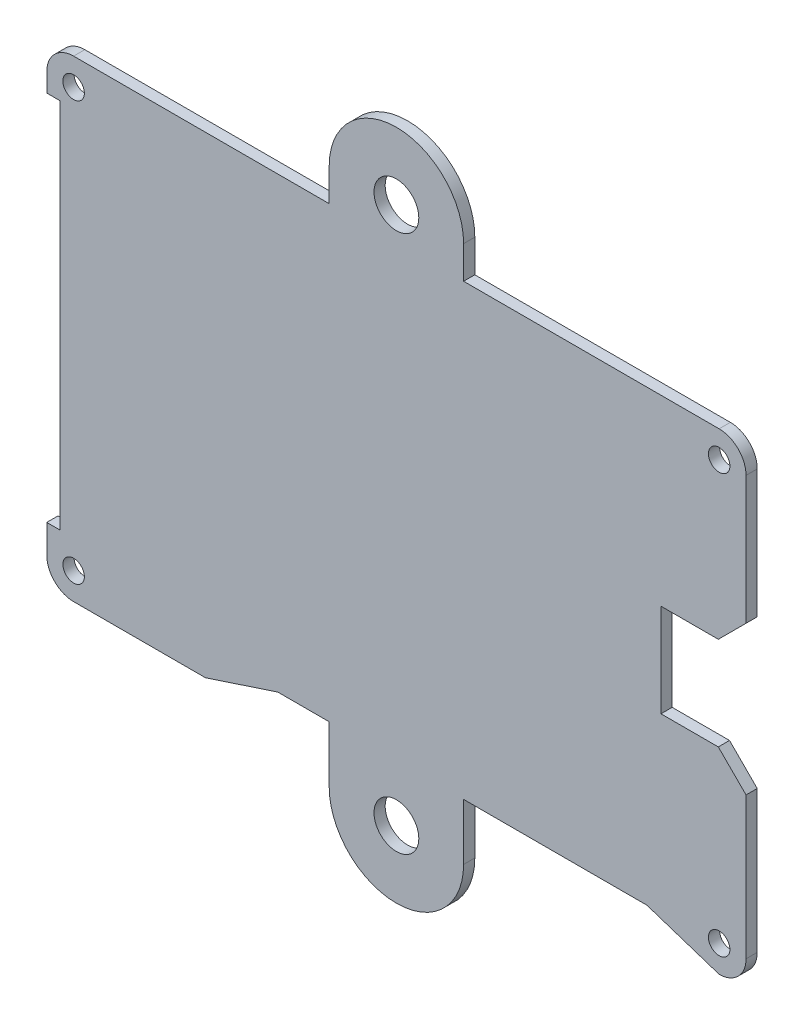
ISO-10303-21;
HEADER;
FILE_DESCRIPTION(('STEP AP214'),'2;1');
FILE_NAME('part.step','',(''),(''),'','','');
FILE_SCHEMA(('AUTOMOTIVE_DESIGN { 1 0 10303 214 1 1 1 1 }'));
ENDSEC;
DATA;
#1=APPLICATION_CONTEXT('core data for automotive mechanical design processes');
#2=APPLICATION_PROTOCOL_DEFINITION('international standard','automotive_design',2000,#1);
#3=PRODUCT_CONTEXT('',#1,'mechanical');
#4=PRODUCT('Part','Part','',(#3));
#5=PRODUCT_RELATED_PRODUCT_CATEGORY('part','',(#4));
#6=PRODUCT_DEFINITION_FORMATION('','',#4);
#7=PRODUCT_DEFINITION_CONTEXT('part definition',#1,'design');
#8=PRODUCT_DEFINITION('design','',#6,#7);
#9=PRODUCT_DEFINITION_SHAPE('','',#8);
#10=(LENGTH_UNIT() NAMED_UNIT(*) SI_UNIT(.MILLI.,.METRE.));
#11=(NAMED_UNIT(*) PLANE_ANGLE_UNIT() SI_UNIT($,.RADIAN.));
#12=(NAMED_UNIT(*) SI_UNIT($,.STERADIAN.) SOLID_ANGLE_UNIT());
#13=UNCERTAINTY_MEASURE_WITH_UNIT(LENGTH_MEASURE(1.E-05),#10,'distance_accuracy_value','');
#14=(GEOMETRIC_REPRESENTATION_CONTEXT(3) GLOBAL_UNCERTAINTY_ASSIGNED_CONTEXT((#13)) GLOBAL_UNIT_ASSIGNED_CONTEXT((#10,
#11,#12)) REPRESENTATION_CONTEXT('',''));
#15=CARTESIAN_POINT('',(0.,0.,0.));
#16=DIRECTION('',(0.,0.,1.));
#17=DIRECTION('',(1.,0.,0.));
#18=AXIS2_PLACEMENT_3D('',#15,#16,#17);
#19=CARTESIAN_POINT('',(-368.3165,91.1883,1.5875));
#20=DIRECTION('',(0.,1.,0.));
#21=DIRECTION('',(-1.,0.,0.));
#22=AXIS2_PLACEMENT_3D('',#19,#20,#21);
#23=PLANE('',#22);
#24=DIRECTION('',(0.,0.,1.));
#25=VECTOR('',#24,1.);
#26=CARTESIAN_POINT('',(-361.0272,91.1883,0.));
#27=LINE('',#26,#25);
#28=CARTESIAN_POINT('',(-361.0272,91.1883,0.));
#29=VERTEX_POINT('',#28);
#30=CARTESIAN_POINT('',(-361.0272,91.1883,1.5875));
#31=VERTEX_POINT('',#30);
#32=EDGE_CURVE('E423',#29,#31,#27,.T.);
#33=ORIENTED_EDGE('',*,*,#32,.T.);
#34=DIRECTION('',(1.,0.,0.));
#35=VECTOR('',#34,1.);
#36=CARTESIAN_POINT('',(-368.3165,91.1883,1.5875));
#37=LINE('',#36,#35);
#38=CARTESIAN_POINT('',(-368.3165,91.1883,1.5875));
#39=VERTEX_POINT('',#38);
#40=EDGE_CURVE('E368',#39,#31,#37,.T.);
#41=ORIENTED_EDGE('',*,*,#40,.F.);
#42=DIRECTION('',(0.,0.,-1.));
#43=VECTOR('',#42,1.);
#44=CARTESIAN_POINT('',(-368.3165,91.1883,1.5875));
#45=LINE('',#44,#43);
#46=CARTESIAN_POINT('',(-368.3165,91.1883,0.));
#47=VERTEX_POINT('',#46);
#48=EDGE_CURVE('E301',#39,#47,#45,.T.);
#49=ORIENTED_EDGE('',*,*,#48,.T.);
#50=DIRECTION('',(1.,0.,0.));
#51=VECTOR('',#50,1.);
#52=CARTESIAN_POINT('',(-368.3165,91.1883,0.));
#53=LINE('',#52,#51);
#54=EDGE_CURVE('E283',#47,#29,#53,.T.);
#55=ORIENTED_EDGE('',*,*,#54,.T.);
#56=EDGE_LOOP('',(#33,#41,#49,#55));
#57=FACE_BOUND('',#56,.T.);
#58=ADVANCED_FACE('F35',(#57),#23,.F.);
#59=CARTESIAN_POINT('',(-305.7573,154.7804,1.5875));
#60=DIRECTION('',(0.,-1.,0.));
#61=DIRECTION('',(1.,0.,0.));
#62=AXIS2_PLACEMENT_3D('',#59,#60,#61);
#63=PLANE('',#62);
#64=DIRECTION('',(0.,0.,1.));
#65=VECTOR('',#64,1.);
#66=CARTESIAN_POINT('',(-361.0272,154.7804,0.));
#67=LINE('',#66,#65);
#68=CARTESIAN_POINT('',(-361.0272,154.7804,0.));
#69=VERTEX_POINT('',#68);
#70=CARTESIAN_POINT('',(-361.0272,154.7804,1.5875));
#71=VERTEX_POINT('',#70);
#72=EDGE_CURVE('E362',#69,#71,#67,.T.);
#73=ORIENTED_EDGE('',*,*,#72,.F.);
#74=DIRECTION('',(-1.,0.,0.));
#75=VECTOR('',#74,1.);
#76=CARTESIAN_POINT('',(-305.7573,154.7804,0.));
#77=LINE('',#76,#75);
#78=CARTESIAN_POINT('',(-397.247125,154.7804,0.));
#79=VERTEX_POINT('',#78);
#80=EDGE_CURVE('E260',#69,#79,#77,.T.);
#81=ORIENTED_EDGE('',*,*,#80,.T.);
#82=DIRECTION('',(0.,0.,-1.));
#83=VECTOR('',#82,1.);
#84=CARTESIAN_POINT('',(-397.247125,154.7804,1.5875));
#85=LINE('',#84,#83);
#86=CARTESIAN_POINT('',(-397.247125,154.7804,1.5875));
#87=VERTEX_POINT('',#86);
#88=EDGE_CURVE('E328',#87,#79,#85,.T.);
#89=ORIENTED_EDGE('',*,*,#88,.F.);
#90=DIRECTION('',(-1.,0.,0.));
#91=VECTOR('',#90,1.);
#92=CARTESIAN_POINT('',(-305.7573,154.7804,1.5875));
#93=LINE('',#92,#91);
#94=EDGE_CURVE('E393',#71,#87,#93,.T.);
#95=ORIENTED_EDGE('',*,*,#94,.F.);
#96=EDGE_LOOP('',(#73,#81,#89,#95));
#97=FACE_BOUND('',#96,.T.);
#98=ADVANCED_FACE('F565',(#97),#63,.F.);
#99=CARTESIAN_POINT('',(-305.7573,150.9704,1.5875));
#100=DIRECTION('',(0.,0.,1.));
#101=DIRECTION('',(1.,0.,0.));
#102=AXIS2_PLACEMENT_3D('',#99,#100,#101);
#103=PLANE('',#102);
#104=DIRECTION('',(-1.,0.,0.));
#105=VECTOR('',#104,1.);
#106=CARTESIAN_POINT('',(-305.87795,115.6771,1.5875));
#107=LINE('',#106,#105);
#108=CARTESIAN_POINT('',(-305.87795,115.6771,1.5875));
#109=VERTEX_POINT('',#108);
#110=CARTESIAN_POINT('',(-314.004803439884,115.6771,1.5875));
#111=VERTEX_POINT('',#110);
#112=EDGE_CURVE('E346',#109,#111,#107,.T.);
#113=ORIENTED_EDGE('',*,*,#112,.T.);
#114=DIRECTION('',(0.,1.,0.));
#115=VECTOR('',#114,1.);
#116=CARTESIAN_POINT('',(-314.004803439884,128.8851,1.5875));
#117=LINE('',#116,#115);
#118=CARTESIAN_POINT('',(-314.004803439884,128.8851,1.5875));
#119=VERTEX_POINT('',#118);
#120=EDGE_CURVE('E50',#111,#119,#117,.T.);
#121=ORIENTED_EDGE('',*,*,#120,.T.);
#122=DIRECTION('',(1.,0.,0.));
#123=VECTOR('',#122,1.);
#124=CARTESIAN_POINT('',(-316.1078,128.8851,1.5875));
#125=LINE('',#124,#123);
#126=CARTESIAN_POINT('',(-305.87795,128.8851,1.5875));
#127=VERTEX_POINT('',#126);
#128=EDGE_CURVE('E242',#119,#127,#125,.T.);
#129=ORIENTED_EDGE('',*,*,#128,.T.);
#130=DIRECTION('',(0.70710678118655,0.707106781186545,0.));
#131=VECTOR('',#130,1.);
#132=CARTESIAN_POINT('',(-305.87795,128.8851,1.5875));
#133=LINE('',#132,#131);
#134=CARTESIAN_POINT('',(-301.9473,132.81575,1.5875));
#135=VERTEX_POINT('',#134);
#136=EDGE_CURVE('E398',#127,#135,#133,.T.);
#137=ORIENTED_EDGE('',*,*,#136,.T.);
#138=DIRECTION('',(0.,1.,0.));
#139=VECTOR('',#138,1.);
#140=CARTESIAN_POINT('',(-301.9473,132.81575,1.5875));
#141=LINE('',#140,#139);
#142=CARTESIAN_POINT('',(-301.9473,150.9704,1.5875));
#143=VERTEX_POINT('',#142);
#144=EDGE_CURVE('E396',#135,#143,#141,.T.);
#145=ORIENTED_EDGE('',*,*,#144,.T.);
#146=CARTESIAN_POINT('',(-305.7573,150.9704,1.5875));
#147=DIRECTION('',(0.,0.,1.));
#148=DIRECTION('',(1.,0.,0.));
#149=AXIS2_PLACEMENT_3D('',#146,#147,#148);
#150=CIRCLE('',#149,3.80999999999994);
#151=CARTESIAN_POINT('',(-305.7573,154.7804,1.5875));
#152=VERTEX_POINT('',#151);
#153=EDGE_CURVE('E394',#143,#152,#150,.T.);
#154=ORIENTED_EDGE('',*,*,#153,.T.);
#155=CARTESIAN_POINT('',(-341.9772,154.7804,1.5875));
#156=VERTEX_POINT('',#155);
#157=EDGE_CURVE('E390',#152,#156,#93,.T.);
#158=ORIENTED_EDGE('',*,*,#157,.T.);
#159=DIRECTION('',(0.,1.,0.));
#160=VECTOR('',#159,1.);
#161=CARTESIAN_POINT('',(-341.9772,0.,1.5875));
#162=LINE('',#161,#160);
#163=CARTESIAN_POINT('',(-341.9772,159.40105,1.5875));
#164=VERTEX_POINT('',#163);
#165=EDGE_CURVE('E417',#156,#164,#162,.T.);
#166=ORIENTED_EDGE('',*,*,#165,.T.);
#167=CARTESIAN_POINT('',(-351.5022,159.40105,1.5875));
#168=DIRECTION('',(0.,0.,1.));
#169=DIRECTION('',(1.,0.,0.));
#170=AXIS2_PLACEMENT_3D('',#167,#168,#169);
#171=CIRCLE('',#170,9.52500000000001);
#172=CARTESIAN_POINT('',(-361.0272,159.40105,1.5875));
#173=VERTEX_POINT('',#172);
#174=EDGE_CURVE('E414',#164,#173,#171,.T.);
#175=ORIENTED_EDGE('',*,*,#174,.T.);
#176=DIRECTION('',(0.,1.,0.));
#177=VECTOR('',#176,1.);
#178=CARTESIAN_POINT('',(-361.0272,0.,1.5875));
#179=LINE('',#178,#177);
#180=EDGE_CURVE('E410',#71,#173,#179,.T.);
#181=ORIENTED_EDGE('',*,*,#180,.F.);
#182=ORIENTED_EDGE('',*,*,#94,.T.);
#183=CARTESIAN_POINT('',(-397.247125,150.9704,1.5875));
#184=DIRECTION('',(0.,0.,1.));
#185=DIRECTION('',(1.,0.,0.));
#186=AXIS2_PLACEMENT_3D('',#183,#184,#185);
#187=CIRCLE('',#186,3.81000000000001);
#188=CARTESIAN_POINT('',(-401.0571,150.956597848903,1.5875));
#189=VERTEX_POINT('',#188);
#190=EDGE_CURVE('E388',#87,#189,#187,.T.);
#191=ORIENTED_EDGE('',*,*,#190,.T.);
#192=DIRECTION('',(0.,-1.,0.));
#193=VECTOR('',#192,1.);
#194=CARTESIAN_POINT('',(-401.0571,150.956597848903,1.5875));
#195=LINE('',#194,#193);
#196=CARTESIAN_POINT('',(-401.0571,148.341,1.5875));
#197=VERTEX_POINT('',#196);
#198=EDGE_CURVE('E386',#189,#197,#195,.T.);
#199=ORIENTED_EDGE('',*,*,#198,.T.);
#200=DIRECTION('',(1.,0.,0.));
#201=VECTOR('',#200,1.);
#202=CARTESIAN_POINT('',(-401.0571,148.341,1.5875));
#203=LINE('',#202,#201);
#204=CARTESIAN_POINT('',(-399.1521,148.341,1.5875));
#205=VERTEX_POINT('',#204);
#206=EDGE_CURVE('E384',#197,#205,#203,.T.);
#207=ORIENTED_EDGE('',*,*,#206,.T.);
#208=DIRECTION('',(0.,-1.,0.));
#209=VECTOR('',#208,1.);
#210=CARTESIAN_POINT('',(-399.1521,148.341,1.5875));
#211=LINE('',#210,#209);
#212=CARTESIAN_POINT('',(-399.1521,95.6449,1.5875));
#213=VERTEX_POINT('',#212);
#214=EDGE_CURVE('E382',#205,#213,#211,.T.);
#215=ORIENTED_EDGE('',*,*,#214,.T.);
#216=DIRECTION('',(-1.,0.,0.));
#217=VECTOR('',#216,1.);
#218=CARTESIAN_POINT('',(-399.1521,95.6449,1.5875));
#219=LINE('',#218,#217);
#220=CARTESIAN_POINT('',(-401.0571,95.6449,1.5875));
#221=VERTEX_POINT('',#220);
#222=EDGE_CURVE('E380',#213,#221,#219,.T.);
#223=ORIENTED_EDGE('',*,*,#222,.T.);
#224=DIRECTION('',(0.,-1.,0.));
#225=VECTOR('',#224,1.);
#226=CARTESIAN_POINT('',(-401.0571,95.6449,1.5875));
#227=LINE('',#226,#225);
#228=CARTESIAN_POINT('',(-401.0571,91.6593041663556,1.5875));
#229=VERTEX_POINT('',#228);
#230=EDGE_CURVE('E378',#221,#229,#227,.T.);
#231=ORIENTED_EDGE('',*,*,#230,.T.);
#232=CARTESIAN_POINT('',(-397.2472,91.6317,1.5875));
#233=DIRECTION('',(0.,0.,1.));
#234=DIRECTION('',(1.,0.,0.));
#235=AXIS2_PLACEMENT_3D('',#232,#233,#234);
#236=CIRCLE('',#235,3.81);
#237=CARTESIAN_POINT('',(-397.2472,87.8217,1.5875));
#238=VERTEX_POINT('',#237);
#239=EDGE_CURVE('E376',#229,#238,#236,.T.);
#240=ORIENTED_EDGE('',*,*,#239,.T.);
#241=DIRECTION('',(1.,0.,0.));
#242=VECTOR('',#241,1.);
#243=CARTESIAN_POINT('',(-397.2472,87.8217,1.5875));
#244=LINE('',#243,#242);
#245=CARTESIAN_POINT('',(-378.5565,87.8217,1.5875));
#246=VERTEX_POINT('',#245);
#247=EDGE_CURVE('E374',#238,#246,#244,.T.);
#248=ORIENTED_EDGE('',*,*,#247,.T.);
#249=DIRECTION('',(0.949975924247208,0.312323139313538,0.));
#250=VECTOR('',#249,1.);
#251=CARTESIAN_POINT('',(-378.5565,87.8217,1.5875));
#252=LINE('',#251,#250);
#253=EDGE_CURVE('E372',#246,#39,#252,.T.);
#254=ORIENTED_EDGE('',*,*,#253,.T.);
#255=ORIENTED_EDGE('',*,*,#40,.T.);
#256=DIRECTION('',(0.,1.,0.));
#257=VECTOR('',#256,1.);
#258=CARTESIAN_POINT('',(-361.0272,0.,1.5875));
#259=LINE('',#258,#257);
#260=CARTESIAN_POINT('',(-361.0272,83.20105,1.5875));
#261=VERTEX_POINT('',#260);
#262=EDGE_CURVE('E446',#261,#31,#259,.T.);
#263=ORIENTED_EDGE('',*,*,#262,.F.);
#264=CARTESIAN_POINT('',(-351.5022,83.20105,1.5875));
#265=DIRECTION('',(0.,0.,1.));
#266=DIRECTION('',(1.,0.,0.));
#267=AXIS2_PLACEMENT_3D('',#264,#265,#266);
#268=CIRCLE('',#267,9.52500000000001);
#269=CARTESIAN_POINT('',(-341.9772,83.20105,1.5875));
#270=VERTEX_POINT('',#269);
#271=EDGE_CURVE('E444',#261,#270,#268,.T.);
#272=ORIENTED_EDGE('',*,*,#271,.T.);
#273=DIRECTION('',(0.,1.,0.));
#274=VECTOR('',#273,1.);
#275=CARTESIAN_POINT('',(-341.9772,0.,1.5875));
#276=LINE('',#275,#274);
#277=CARTESIAN_POINT('',(-341.9772,91.1883,1.5875));
#278=VERTEX_POINT('',#277);
#279=EDGE_CURVE('E57',#270,#278,#276,.T.);
#280=ORIENTED_EDGE('',*,*,#279,.T.);
#281=CARTESIAN_POINT('',(-315.9973,91.1883,1.5875));
#282=VERTEX_POINT('',#281);
#283=EDGE_CURVE('E371',#278,#282,#37,.T.);
#284=ORIENTED_EDGE('',*,*,#283,.T.);
#285=DIRECTION('',(0.949975924247207,-0.312323139313541,0.));
#286=VECTOR('',#285,1.);
#287=CARTESIAN_POINT('',(-315.9973,91.1883,1.5875));
#288=LINE('',#287,#286);
#289=CARTESIAN_POINT('',(-305.7573,87.8217,1.5875));
#290=VERTEX_POINT('',#289);
#291=EDGE_CURVE('E366',#282,#290,#288,.T.);
#292=ORIENTED_EDGE('',*,*,#291,.T.);
#293=CARTESIAN_POINT('',(-305.7573,91.6317,1.5875));
#294=DIRECTION('',(0.,0.,1.));
#295=DIRECTION('',(1.,0.,0.));
#296=AXIS2_PLACEMENT_3D('',#293,#294,#295);
#297=CIRCLE('',#296,3.81);
#298=CARTESIAN_POINT('',(-301.9473,91.6317,1.5875));
#299=VERTEX_POINT('',#298);
#300=EDGE_CURVE('E295',#290,#299,#297,.T.);
#301=ORIENTED_EDGE('',*,*,#300,.T.);
#302=DIRECTION('',(0.,1.,0.));
#303=VECTOR('',#302,1.);
#304=CARTESIAN_POINT('',(-301.9473,91.6317,1.5875));
#305=LINE('',#304,#303);
#306=CARTESIAN_POINT('',(-301.9473,111.74645,1.5875));
#307=VERTEX_POINT('',#306);
#308=EDGE_CURVE('E290',#299,#307,#305,.T.);
#309=ORIENTED_EDGE('',*,*,#308,.T.);
#310=DIRECTION('',(-0.70710678118655,0.707106781186545,0.));
#311=VECTOR('',#310,1.);
#312=CARTESIAN_POINT('',(-301.9473,111.74645,1.5875));
#313=LINE('',#312,#311);
#314=EDGE_CURVE('E354',#307,#109,#313,.T.);
#315=ORIENTED_EDGE('',*,*,#314,.T.);
#316=EDGE_LOOP('',(#113,#121,#129,#137,#145,#154,#158,#166,#175,#181,#182,#191,#199,#207,#215,
#223,#231,#240,#248,#254,#255,#263,#272,#280,#284,#292,#301,#309,#315));
#317=FACE_BOUND('',#316,.T.);
#318=CARTESIAN_POINT('',(-397.2472,91.6317,1.5875));
#319=DIRECTION('',(0.,0.,1.));
#320=DIRECTION('',(1.,0.,0.));
#321=AXIS2_PLACEMENT_3D('',#318,#319,#320);
#322=CIRCLE('',#321,1.52400000000001);
#323=CARTESIAN_POINT('',(-395.7232,91.6317,1.5875));
#324=VERTEX_POINT('',#323);
#325=EDGE_CURVE('E478',#324,#324,#322,.T.);
#326=ORIENTED_EDGE('',*,*,#325,.F.);
#327=EDGE_LOOP('',(#326));
#328=FACE_BOUND('',#327,.T.);
#329=CARTESIAN_POINT('',(-305.7573,91.6317,1.5875));
#330=DIRECTION('',(0.,0.,1.));
#331=DIRECTION('',(1.,0.,0.));
#332=AXIS2_PLACEMENT_3D('',#329,#330,#331);
#333=CIRCLE('',#332,1.52400000000001);
#334=CARTESIAN_POINT('',(-304.2333,91.6317,1.5875));
#335=VERTEX_POINT('',#334);
#336=EDGE_CURVE('E472',#335,#335,#333,.T.);
#337=ORIENTED_EDGE('',*,*,#336,.F.);
#338=EDGE_LOOP('',(#337));
#339=FACE_BOUND('',#338,.T.);
#340=CARTESIAN_POINT('',(-305.7573,150.9704,1.5875));
#341=DIRECTION('',(0.,0.,1.));
#342=DIRECTION('',(1.,0.,0.));
#343=AXIS2_PLACEMENT_3D('',#340,#341,#342);
#344=CIRCLE('',#343,1.52400000000001);
#345=CARTESIAN_POINT('',(-304.2333,150.9704,1.5875));
#346=VERTEX_POINT('',#345);
#347=EDGE_CURVE('E466',#346,#346,#344,.T.);
#348=ORIENTED_EDGE('',*,*,#347,.F.);
#349=EDGE_LOOP('',(#348));
#350=FACE_BOUND('',#349,.T.);
#351=CARTESIAN_POINT('',(-397.247125,150.9704,1.5875));
#352=DIRECTION('',(0.,0.,1.));
#353=DIRECTION('',(1.,0.,0.));
#354=AXIS2_PLACEMENT_3D('',#351,#352,#353);
#355=CIRCLE('',#354,1.52400000000001);
#356=CARTESIAN_POINT('',(-395.723125,150.9704,1.5875));
#357=VERTEX_POINT('',#356);
#358=EDGE_CURVE('E460',#357,#357,#355,.T.);
#359=ORIENTED_EDGE('',*,*,#358,.F.);
#360=EDGE_LOOP('',(#359));
#361=FACE_BOUND('',#360,.T.);
#362=CARTESIAN_POINT('',(-351.5022,159.40105,1.5875));
#363=DIRECTION('',(0.,0.,1.));
#364=DIRECTION('',(1.,0.,0.));
#365=AXIS2_PLACEMENT_3D('',#362,#363,#364);
#366=CIRCLE('',#365,3.17499999999997);
#367=CARTESIAN_POINT('',(-348.3272,159.40105,1.5875));
#368=VERTEX_POINT('',#367);
#369=EDGE_CURVE('E420',#368,#368,#366,.T.);
#370=ORIENTED_EDGE('',*,*,#369,.F.);
#371=EDGE_LOOP('',(#370));
#372=FACE_BOUND('',#371,.T.);
#373=CARTESIAN_POINT('',(-351.5022,83.20105,1.5875));
#374=DIRECTION('',(0.,0.,1.));
#375=DIRECTION('',(1.,0.,0.));
#376=AXIS2_PLACEMENT_3D('',#373,#374,#375);
#377=CIRCLE('',#376,3.17499999999997);
#378=CARTESIAN_POINT('',(-348.3272,83.20105,1.5875));
#379=VERTEX_POINT('',#378);
#380=EDGE_CURVE('E448',#379,#379,#377,.T.);
#381=ORIENTED_EDGE('',*,*,#380,.F.);
#382=EDGE_LOOP('',(#381));
#383=FACE_BOUND('',#382,.T.);
#384=ADVANCED_FACE('F484',(#317,#328,#339,#350,#361,#372,#383),#103,.T.);
#385=CARTESIAN_POINT('',(-305.7573,150.9704,0.));
#386=DIRECTION('',(0.,0.,1.));
#387=DIRECTION('',(1.,0.,0.));
#388=AXIS2_PLACEMENT_3D('',#385,#386,#387);
#389=PLANE('',#388);
#390=DIRECTION('',(0.,1.,0.));
#391=VECTOR('',#390,1.);
#392=CARTESIAN_POINT('',(-314.004803439884,128.8851,0.));
#393=LINE('',#392,#391);
#394=CARTESIAN_POINT('',(-314.004803439884,115.6771,0.));
#395=VERTEX_POINT('',#394);
#396=CARTESIAN_POINT('',(-314.004803439884,128.8851,0.));
#397=VERTEX_POINT('',#396);
#398=EDGE_CURVE('E225',#395,#397,#393,.T.);
#399=ORIENTED_EDGE('',*,*,#398,.F.);
#400=DIRECTION('',(-1.,0.,0.));
#401=VECTOR('',#400,1.);
#402=CARTESIAN_POINT('',(-305.87795,115.6771,0.));
#403=LINE('',#402,#401);
#404=CARTESIAN_POINT('',(-305.87795,115.6771,0.));
#405=VERTEX_POINT('',#404);
#406=EDGE_CURVE('E249',#405,#395,#403,.T.);
#407=ORIENTED_EDGE('',*,*,#406,.F.);
#408=DIRECTION('',(-0.70710678118655,0.707106781186545,0.));
#409=VECTOR('',#408,1.);
#410=CARTESIAN_POINT('',(-301.9473,111.74645,0.));
#411=LINE('',#410,#409);
#412=CARTESIAN_POINT('',(-301.9473,111.74645,0.));
#413=VERTEX_POINT('',#412);
#414=EDGE_CURVE('E253',#413,#405,#411,.T.);
#415=ORIENTED_EDGE('',*,*,#414,.F.);
#416=DIRECTION('',(0.,1.,0.));
#417=VECTOR('',#416,1.);
#418=CARTESIAN_POINT('',(-301.9473,91.6317,0.));
#419=LINE('',#418,#417);
#420=CARTESIAN_POINT('',(-301.9473,91.6317,0.));
#421=VERTEX_POINT('',#420);
#422=EDGE_CURVE('E351',#421,#413,#419,.T.);
#423=ORIENTED_EDGE('',*,*,#422,.F.);
#424=CARTESIAN_POINT('',(-305.7573,91.6317,0.));
#425=DIRECTION('',(0.,0.,1.));
#426=DIRECTION('',(1.,0.,0.));
#427=AXIS2_PLACEMENT_3D('',#424,#425,#426);
#428=CIRCLE('',#427,3.81);
#429=CARTESIAN_POINT('',(-305.7573,87.8217,0.));
#430=VERTEX_POINT('',#429);
#431=EDGE_CURVE('E288',#430,#421,#428,.T.);
#432=ORIENTED_EDGE('',*,*,#431,.F.);
#433=DIRECTION('',(0.949975924247207,-0.312323139313541,0.));
#434=VECTOR('',#433,1.);
#435=CARTESIAN_POINT('',(-315.9973,91.1883,0.));
#436=LINE('',#435,#434);
#437=CARTESIAN_POINT('',(-315.9973,91.1883,0.));
#438=VERTEX_POINT('',#437);
#439=EDGE_CURVE('E286',#438,#430,#436,.T.);
#440=ORIENTED_EDGE('',*,*,#439,.F.);
#441=CARTESIAN_POINT('',(-341.9772,91.1883,0.));
#442=VERTEX_POINT('',#441);
#443=EDGE_CURVE('E282',#442,#438,#53,.T.);
#444=ORIENTED_EDGE('',*,*,#443,.F.);
#445=DIRECTION('',(0.,1.,0.));
#446=VECTOR('',#445,1.);
#447=CARTESIAN_POINT('',(-341.9772,0.,0.));
#448=LINE('',#447,#446);
#449=CARTESIAN_POINT('',(-341.9772,83.20105,0.));
#450=VERTEX_POINT('',#449);
#451=EDGE_CURVE('E436',#450,#442,#448,.T.);
#452=ORIENTED_EDGE('',*,*,#451,.F.);
#453=CARTESIAN_POINT('',(-351.5022,83.20105,0.));
#454=DIRECTION('',(0.,0.,1.));
#455=DIRECTION('',(1.,0.,0.));
#456=AXIS2_PLACEMENT_3D('',#453,#454,#455);
#457=CIRCLE('',#456,9.52500000000001);
#458=CARTESIAN_POINT('',(-361.0272,83.20105,0.));
#459=VERTEX_POINT('',#458);
#460=EDGE_CURVE('E453',#459,#450,#457,.T.);
#461=ORIENTED_EDGE('',*,*,#460,.F.);
#462=DIRECTION('',(0.,1.,0.));
#463=VECTOR('',#462,1.);
#464=CARTESIAN_POINT('',(-361.0272,0.,0.));
#465=LINE('',#464,#463);
#466=EDGE_CURVE('E456',#459,#29,#465,.T.);
#467=ORIENTED_EDGE('',*,*,#466,.T.);
#468=ORIENTED_EDGE('',*,*,#54,.F.);
#469=DIRECTION('',(0.949975924247208,0.312323139313538,0.));
#470=VECTOR('',#469,1.);
#471=CARTESIAN_POINT('',(-378.5565,87.8217,0.));
#472=LINE('',#471,#470);
#473=CARTESIAN_POINT('',(-378.5565,87.8217,0.));
#474=VERTEX_POINT('',#473);
#475=EDGE_CURVE('E280',#474,#47,#472,.T.);
#476=ORIENTED_EDGE('',*,*,#475,.F.);
#477=DIRECTION('',(1.,0.,0.));
#478=VECTOR('',#477,1.);
#479=CARTESIAN_POINT('',(-397.2472,87.8217,0.));
#480=LINE('',#479,#478);
#481=CARTESIAN_POINT('',(-397.2472,87.8217,0.));
#482=VERTEX_POINT('',#481);
#483=EDGE_CURVE('E278',#482,#474,#480,.T.);
#484=ORIENTED_EDGE('',*,*,#483,.F.);
#485=CARTESIAN_POINT('',(-397.2472,91.6317,0.));
#486=DIRECTION('',(0.,0.,1.));
#487=DIRECTION('',(1.,0.,0.));
#488=AXIS2_PLACEMENT_3D('',#485,#486,#487);
#489=CIRCLE('',#488,3.81);
#490=CARTESIAN_POINT('',(-401.0571,91.6593041663556,0.));
#491=VERTEX_POINT('',#490);
#492=EDGE_CURVE('E276',#491,#482,#489,.T.);
#493=ORIENTED_EDGE('',*,*,#492,.F.);
#494=DIRECTION('',(0.,-1.,0.));
#495=VECTOR('',#494,1.);
#496=CARTESIAN_POINT('',(-401.0571,95.6449,0.));
#497=LINE('',#496,#495);
#498=CARTESIAN_POINT('',(-401.0571,95.6449,0.));
#499=VERTEX_POINT('',#498);
#500=EDGE_CURVE('E274',#499,#491,#497,.T.);
#501=ORIENTED_EDGE('',*,*,#500,.F.);
#502=DIRECTION('',(-1.,0.,0.));
#503=VECTOR('',#502,1.);
#504=CARTESIAN_POINT('',(-399.1521,95.6449,0.));
#505=LINE('',#504,#503);
#506=CARTESIAN_POINT('',(-399.1521,95.6449,0.));
#507=VERTEX_POINT('',#506);
#508=EDGE_CURVE('E272',#507,#499,#505,.T.);
#509=ORIENTED_EDGE('',*,*,#508,.F.);
#510=DIRECTION('',(0.,-1.,0.));
#511=VECTOR('',#510,1.);
#512=CARTESIAN_POINT('',(-399.1521,148.341,0.));
#513=LINE('',#512,#511);
#514=CARTESIAN_POINT('',(-399.1521,148.341,0.));
#515=VERTEX_POINT('',#514);
#516=EDGE_CURVE('E270',#515,#507,#513,.T.);
#517=ORIENTED_EDGE('',*,*,#516,.F.);
#518=DIRECTION('',(1.,0.,0.));
#519=VECTOR('',#518,1.);
#520=CARTESIAN_POINT('',(-401.0571,148.341,0.));
#521=LINE('',#520,#519);
#522=CARTESIAN_POINT('',(-401.0571,148.341,0.));
#523=VERTEX_POINT('',#522);
#524=EDGE_CURVE('E268',#523,#515,#521,.T.);
#525=ORIENTED_EDGE('',*,*,#524,.F.);
#526=DIRECTION('',(0.,-1.,0.));
#527=VECTOR('',#526,1.);
#528=CARTESIAN_POINT('',(-401.0571,150.956597848903,0.));
#529=LINE('',#528,#527);
#530=CARTESIAN_POINT('',(-401.0571,150.956597848903,0.));
#531=VERTEX_POINT('',#530);
#532=EDGE_CURVE('E266',#531,#523,#529,.T.);
#533=ORIENTED_EDGE('',*,*,#532,.F.);
#534=CARTESIAN_POINT('',(-397.247125,150.9704,0.));
#535=DIRECTION('',(0.,0.,1.));
#536=DIRECTION('',(1.,0.,0.));
#537=AXIS2_PLACEMENT_3D('',#534,#535,#536);
#538=CIRCLE('',#537,3.81000000000001);
#539=EDGE_CURVE('E264',#79,#531,#538,.T.);
#540=ORIENTED_EDGE('',*,*,#539,.F.);
#541=ORIENTED_EDGE('',*,*,#80,.F.);
#542=DIRECTION('',(0.,1.,0.));
#543=VECTOR('',#542,1.);
#544=CARTESIAN_POINT('',(-361.0272,0.,0.));
#545=LINE('',#544,#543);
#546=CARTESIAN_POINT('',(-361.0272,159.40105,0.));
#547=VERTEX_POINT('',#546);
#548=EDGE_CURVE('E407',#69,#547,#545,.T.);
#549=ORIENTED_EDGE('',*,*,#548,.T.);
#550=CARTESIAN_POINT('',(-351.5022,159.40105,0.));
#551=DIRECTION('',(0.,0.,1.));
#552=DIRECTION('',(1.,0.,0.));
#553=AXIS2_PLACEMENT_3D('',#550,#551,#552);
#554=CIRCLE('',#553,9.52500000000001);
#555=CARTESIAN_POINT('',(-341.9772,159.40105,0.));
#556=VERTEX_POINT('',#555);
#557=EDGE_CURVE('E425',#556,#547,#554,.T.);
#558=ORIENTED_EDGE('',*,*,#557,.F.);
#559=DIRECTION('',(0.,1.,0.));
#560=VECTOR('',#559,1.);
#561=CARTESIAN_POINT('',(-341.9772,0.,0.));
#562=LINE('',#561,#560);
#563=CARTESIAN_POINT('',(-341.9772,154.7804,0.));
#564=VERTEX_POINT('',#563);
#565=EDGE_CURVE('E428',#564,#556,#562,.T.);
#566=ORIENTED_EDGE('',*,*,#565,.F.);
#567=CARTESIAN_POINT('',(-305.7573,154.7804,0.));
#568=VERTEX_POINT('',#567);
#569=EDGE_CURVE('E261',#568,#564,#77,.T.);
#570=ORIENTED_EDGE('',*,*,#569,.F.);
#571=CARTESIAN_POINT('',(-305.7573,150.9704,0.));
#572=DIRECTION('',(0.,0.,1.));
#573=DIRECTION('',(1.,0.,0.));
#574=AXIS2_PLACEMENT_3D('',#571,#572,#573);
#575=CIRCLE('',#574,3.80999999999994);
#576=CARTESIAN_POINT('',(-301.9473,150.9704,0.));
#577=VERTEX_POINT('',#576);
#578=EDGE_CURVE('E258',#577,#568,#575,.T.);
#579=ORIENTED_EDGE('',*,*,#578,.F.);
#580=DIRECTION('',(0.,1.,0.));
#581=VECTOR('',#580,1.);
#582=CARTESIAN_POINT('',(-301.9473,132.81575,0.));
#583=LINE('',#582,#581);
#584=CARTESIAN_POINT('',(-301.9473,132.81575,0.));
#585=VERTEX_POINT('',#584);
#586=EDGE_CURVE('E251',#585,#577,#583,.T.);
#587=ORIENTED_EDGE('',*,*,#586,.F.);
#588=DIRECTION('',(0.70710678118655,0.707106781186545,0.));
#589=VECTOR('',#588,1.);
#590=CARTESIAN_POINT('',(-305.87795,128.8851,0.));
#591=LINE('',#590,#589);
#592=CARTESIAN_POINT('',(-305.87795,128.8851,0.));
#593=VERTEX_POINT('',#592);
#594=EDGE_CURVE('E248',#593,#585,#591,.T.);
#595=ORIENTED_EDGE('',*,*,#594,.F.);
#596=DIRECTION('',(1.,0.,0.));
#597=VECTOR('',#596,1.);
#598=CARTESIAN_POINT('',(-316.1078,128.8851,0.));
#599=LINE('',#598,#597);
#600=EDGE_CURVE('E240',#397,#593,#599,.T.);
#601=ORIENTED_EDGE('',*,*,#600,.F.);
#602=EDGE_LOOP('',(#399,#407,#415,#423,#432,#440,#444,#452,#461,#467,#468,#476,#484,#493,#501,
#509,#517,#525,#533,#540,#541,#549,#558,#566,#570,#579,#587,#595,#601));
#603=FACE_BOUND('',#602,.T.);
#604=CARTESIAN_POINT('',(-397.2472,91.6317,0.));
#605=DIRECTION('',(0.,0.,1.));
#606=DIRECTION('',(1.,0.,0.));
#607=AXIS2_PLACEMENT_3D('',#604,#605,#606);
#608=CIRCLE('',#607,1.52400000000001);
#609=CARTESIAN_POINT('',(-395.7232,91.6317,0.));
#610=VERTEX_POINT('',#609);
#611=EDGE_CURVE('E475',#610,#610,#608,.T.);
#612=ORIENTED_EDGE('',*,*,#611,.T.);
#613=EDGE_LOOP('',(#612));
#614=FACE_BOUND('',#613,.T.);
#615=CARTESIAN_POINT('',(-305.7573,91.6317,0.));
#616=DIRECTION('',(0.,0.,1.));
#617=DIRECTION('',(1.,0.,0.));
#618=AXIS2_PLACEMENT_3D('',#615,#616,#617);
#619=CIRCLE('',#618,1.52400000000001);
#620=CARTESIAN_POINT('',(-304.2333,91.6317,0.));
#621=VERTEX_POINT('',#620);
#622=EDGE_CURVE('E469',#621,#621,#619,.T.);
#623=ORIENTED_EDGE('',*,*,#622,.T.);
#624=EDGE_LOOP('',(#623));
#625=FACE_BOUND('',#624,.T.);
#626=CARTESIAN_POINT('',(-305.7573,150.9704,0.));
#627=DIRECTION('',(0.,0.,1.));
#628=DIRECTION('',(1.,0.,0.));
#629=AXIS2_PLACEMENT_3D('',#626,#627,#628);
#630=CIRCLE('',#629,1.52400000000001);
#631=CARTESIAN_POINT('',(-304.2333,150.9704,0.));
#632=VERTEX_POINT('',#631);
#633=EDGE_CURVE('E463',#632,#632,#630,.T.);
#634=ORIENTED_EDGE('',*,*,#633,.T.);
#635=EDGE_LOOP('',(#634));
#636=FACE_BOUND('',#635,.T.);
#637=CARTESIAN_POINT('',(-397.247125,150.9704,0.));
#638=DIRECTION('',(0.,0.,1.));
#639=DIRECTION('',(1.,0.,0.));
#640=AXIS2_PLACEMENT_3D('',#637,#638,#639);
#641=CIRCLE('',#640,1.52400000000001);
#642=CARTESIAN_POINT('',(-395.723125,150.9704,0.));
#643=VERTEX_POINT('',#642);
#644=EDGE_CURVE('E451',#643,#643,#641,.T.);
#645=ORIENTED_EDGE('',*,*,#644,.T.);
#646=EDGE_LOOP('',(#645));
#647=FACE_BOUND('',#646,.T.);
#648=CARTESIAN_POINT('',(-351.5022,159.40105,0.));
#649=DIRECTION('',(0.,0.,1.));
#650=DIRECTION('',(1.,0.,0.));
#651=AXIS2_PLACEMENT_3D('',#648,#649,#650);
#652=CIRCLE('',#651,3.17499999999997);
#653=CARTESIAN_POINT('',(-348.3272,159.40105,0.));
#654=VERTEX_POINT('',#653);
#655=EDGE_CURVE('E413',#654,#654,#652,.T.);
#656=ORIENTED_EDGE('',*,*,#655,.T.);
#657=EDGE_LOOP('',(#656));
#658=FACE_BOUND('',#657,.T.);
#659=CARTESIAN_POINT('',(-351.5022,83.20105,0.));
#660=DIRECTION('',(0.,0.,1.));
#661=DIRECTION('',(1.,0.,0.));
#662=AXIS2_PLACEMENT_3D('',#659,#660,#661);
#663=CIRCLE('',#662,3.17499999999997);
#664=CARTESIAN_POINT('',(-348.3272,83.20105,0.));
#665=VERTEX_POINT('',#664);
#666=EDGE_CURVE('E443',#665,#665,#663,.T.);
#667=ORIENTED_EDGE('',*,*,#666,.T.);
#668=EDGE_LOOP('',(#667));
#669=FACE_BOUND('',#668,.T.);
#670=ADVANCED_FACE('F245',(#603,#614,#625,#636,#647,#658,#669),#389,.F.);
#671=CARTESIAN_POINT('',(-301.9473,91.6317,1.5875));
#672=DIRECTION('',(-1.,0.,0.));
#673=DIRECTION('',(0.,-1.,0.));
#674=AXIS2_PLACEMENT_3D('',#671,#672,#673);
#675=PLANE('',#674);
#676=ORIENTED_EDGE('',*,*,#422,.T.);
#677=DIRECTION('',(0.,0.,-1.));
#678=VECTOR('',#677,1.);
#679=CARTESIAN_POINT('',(-301.9473,111.74645,1.5875));
#680=LINE('',#679,#678);
#681=EDGE_CURVE('E11',#307,#413,#680,.T.);
#682=ORIENTED_EDGE('',*,*,#681,.F.);
#683=ORIENTED_EDGE('',*,*,#308,.F.);
#684=DIRECTION('',(0.,0.,-1.));
#685=VECTOR('',#684,1.);
#686=CARTESIAN_POINT('',(-301.9473,91.6317,1.5875));
#687=LINE('',#686,#685);
#688=EDGE_CURVE('E291',#299,#421,#687,.T.);
#689=ORIENTED_EDGE('',*,*,#688,.T.);
#690=EDGE_LOOP('',(#676,#682,#683,#689));
#691=FACE_BOUND('',#690,.T.);
#692=ADVANCED_FACE('F37',(#691),#675,.F.);
#693=CARTESIAN_POINT('',(-301.9473,111.74645,1.5875));
#694=DIRECTION('',(-0.707106781186545,-0.70710678118655,0.));
#695=DIRECTION('',(0.70710678118655,-0.707106781186545,0.));
#696=AXIS2_PLACEMENT_3D('',#693,#694,#695);
#697=PLANE('',#696);
#698=ORIENTED_EDGE('',*,*,#414,.T.);
#699=DIRECTION('',(0.,0.,-1.));
#700=VECTOR('',#699,1.);
#701=CARTESIAN_POINT('',(-305.87795,115.6771,1.5875));
#702=LINE('',#701,#700);
#703=EDGE_CURVE('E43',#109,#405,#702,.T.);
#704=ORIENTED_EDGE('',*,*,#703,.F.);
#705=ORIENTED_EDGE('',*,*,#314,.F.);
#706=ORIENTED_EDGE('',*,*,#681,.T.);
#707=EDGE_LOOP('',(#698,#704,#705,#706));
#708=FACE_BOUND('',#707,.T.);
#709=ADVANCED_FACE('F353',(#708),#697,.F.);
#710=CARTESIAN_POINT('',(-305.87795,115.6771,1.5875));
#711=DIRECTION('',(0.,-1.,0.));
#712=DIRECTION('',(0.,0.,-1.));
#713=AXIS2_PLACEMENT_3D('',#710,#711,#712);
#714=PLANE('',#713);
#715=ORIENTED_EDGE('',*,*,#406,.T.);
#716=DIRECTION('',(0.,0.,1.));
#717=VECTOR('',#716,1.);
#718=CARTESIAN_POINT('',(-314.004803439884,115.6771,0.));
#719=LINE('',#718,#717);
#720=EDGE_CURVE('E231',#395,#111,#719,.T.);
#721=ORIENTED_EDGE('',*,*,#720,.T.);
#722=ORIENTED_EDGE('',*,*,#112,.F.);
#723=ORIENTED_EDGE('',*,*,#703,.T.);
#724=EDGE_LOOP('',(#715,#721,#722,#723));
#725=FACE_BOUND('',#724,.T.);
#726=ADVANCED_FACE('F345',(#725),#714,.F.);
#727=CARTESIAN_POINT('',(-316.1078,128.8851,1.5875));
#728=DIRECTION('',(0.,1.,0.));
#729=DIRECTION('',(0.,0.,1.));
#730=AXIS2_PLACEMENT_3D('',#727,#728,#729);
#731=PLANE('',#730);
#732=ORIENTED_EDGE('',*,*,#128,.F.);
#733=DIRECTION('',(0.,0.,1.));
#734=VECTOR('',#733,1.);
#735=CARTESIAN_POINT('',(-314.004803439884,128.8851,0.));
#736=LINE('',#735,#734);
#737=EDGE_CURVE('E228',#397,#119,#736,.T.);
#738=ORIENTED_EDGE('',*,*,#737,.F.);
#739=ORIENTED_EDGE('',*,*,#600,.T.);
#740=DIRECTION('',(0.,0.,-1.));
#741=VECTOR('',#740,1.);
#742=CARTESIAN_POINT('',(-305.87795,128.8851,1.5875));
#743=LINE('',#742,#741);
#744=EDGE_CURVE('E340',#127,#593,#743,.T.);
#745=ORIENTED_EDGE('',*,*,#744,.F.);
#746=EDGE_LOOP('',(#732,#738,#739,#745));
#747=FACE_BOUND('',#746,.T.);
#748=ADVANCED_FACE('F238',(#747),#731,.F.);
#749=CARTESIAN_POINT('',(-305.87795,128.8851,1.5875));
#750=DIRECTION('',(-0.707106781186545,0.70710678118655,0.));
#751=DIRECTION('',(-0.70710678118655,-0.707106781186545,0.));
#752=AXIS2_PLACEMENT_3D('',#749,#750,#751);
#753=PLANE('',#752);
#754=ORIENTED_EDGE('',*,*,#594,.T.);
#755=DIRECTION('',(0.,0.,-1.));
#756=VECTOR('',#755,1.);
#757=CARTESIAN_POINT('',(-301.9473,132.81575,1.5875));
#758=LINE('',#757,#756);
#759=EDGE_CURVE('E337',#135,#585,#758,.T.);
#760=ORIENTED_EDGE('',*,*,#759,.F.);
#761=ORIENTED_EDGE('',*,*,#136,.F.);
#762=ORIENTED_EDGE('',*,*,#744,.T.);
#763=EDGE_LOOP('',(#754,#760,#761,#762));
#764=FACE_BOUND('',#763,.T.);
#765=ADVANCED_FACE('F593',(#764),#753,.F.);
#766=CARTESIAN_POINT('',(-301.9473,132.81575,1.5875));
#767=DIRECTION('',(-1.,0.,0.));
#768=DIRECTION('',(0.,0.,1.));
#769=AXIS2_PLACEMENT_3D('',#766,#767,#768);
#770=PLANE('',#769);
#771=ORIENTED_EDGE('',*,*,#586,.T.);
#772=DIRECTION('',(0.,0.,-1.));
#773=VECTOR('',#772,1.);
#774=CARTESIAN_POINT('',(-301.9473,150.9704,1.5875));
#775=LINE('',#774,#773);
#776=EDGE_CURVE('E334',#143,#577,#775,.T.);
#777=ORIENTED_EDGE('',*,*,#776,.F.);
#778=ORIENTED_EDGE('',*,*,#144,.F.);
#779=ORIENTED_EDGE('',*,*,#759,.T.);
#780=EDGE_LOOP('',(#771,#777,#778,#779));
#781=FACE_BOUND('',#780,.T.);
#782=ADVANCED_FACE('F589',(#781),#770,.F.);
#783=CARTESIAN_POINT('',(-305.7573,150.9704,1.5875));
#784=DIRECTION('',(0.,0.,-1.));
#785=DIRECTION('',(-1.,0.,0.));
#786=AXIS2_PLACEMENT_3D('',#783,#784,#785);
#787=CYLINDRICAL_SURFACE('',#786,3.80999999999994);
#788=ORIENTED_EDGE('',*,*,#578,.T.);
#789=DIRECTION('',(0.,0.,-1.));
#790=VECTOR('',#789,1.);
#791=CARTESIAN_POINT('',(-305.7573,154.7804,1.5875));
#792=LINE('',#791,#790);
#793=EDGE_CURVE('E331',#152,#568,#792,.T.);
#794=ORIENTED_EDGE('',*,*,#793,.F.);
#795=ORIENTED_EDGE('',*,*,#153,.F.);
#796=ORIENTED_EDGE('',*,*,#776,.T.);
#797=EDGE_LOOP('',(#788,#794,#795,#796));
#798=FACE_BOUND('',#797,.T.);
#799=ADVANCED_FACE('F586',(#798),#787,.T.);
#800=ORIENTED_EDGE('',*,*,#569,.T.);
#801=DIRECTION('',(0.,0.,1.));
#802=VECTOR('',#801,1.);
#803=CARTESIAN_POINT('',(-341.9772,154.7804,0.));
#804=LINE('',#803,#802);
#805=EDGE_CURVE('E359',#564,#156,#804,.T.);
#806=ORIENTED_EDGE('',*,*,#805,.T.);
#807=ORIENTED_EDGE('',*,*,#157,.F.);
#808=ORIENTED_EDGE('',*,*,#793,.T.);
#809=EDGE_LOOP('',(#800,#806,#807,#808));
#810=FACE_BOUND('',#809,.T.);
#811=ADVANCED_FACE('F580',(#810),#63,.F.);
#812=CARTESIAN_POINT('',(-397.247125,150.9704,1.5875));
#813=DIRECTION('',(0.,0.,-1.));
#814=DIRECTION('',(-1.,0.,0.));
#815=AXIS2_PLACEMENT_3D('',#812,#813,#814);
#816=CYLINDRICAL_SURFACE('',#815,3.81000000000001);
#817=ORIENTED_EDGE('',*,*,#539,.T.);
#818=DIRECTION('',(0.,0.,-1.));
#819=VECTOR('',#818,1.);
#820=CARTESIAN_POINT('',(-401.0571,150.956597848903,1.5875));
#821=LINE('',#820,#819);
#822=EDGE_CURVE('E325',#189,#531,#821,.T.);
#823=ORIENTED_EDGE('',*,*,#822,.F.);
#824=ORIENTED_EDGE('',*,*,#190,.F.);
#825=ORIENTED_EDGE('',*,*,#88,.T.);
#826=EDGE_LOOP('',(#817,#823,#824,#825));
#827=FACE_BOUND('',#826,.T.);
#828=ADVANCED_FACE('F559',(#827),#816,.T.);
#829=CARTESIAN_POINT('',(-401.0571,150.956597848903,1.5875));
#830=DIRECTION('',(1.,0.,0.));
#831=DIRECTION('',(0.,0.,-1.));
#832=AXIS2_PLACEMENT_3D('',#829,#830,#831);
#833=PLANE('',#832);
#834=ORIENTED_EDGE('',*,*,#532,.T.);
#835=DIRECTION('',(0.,0.,-1.));
#836=VECTOR('',#835,1.);
#837=CARTESIAN_POINT('',(-401.0571,148.341,1.5875));
#838=LINE('',#837,#836);
#839=EDGE_CURVE('E322',#197,#523,#838,.T.);
#840=ORIENTED_EDGE('',*,*,#839,.F.);
#841=ORIENTED_EDGE('',*,*,#198,.F.);
#842=ORIENTED_EDGE('',*,*,#822,.T.);
#843=EDGE_LOOP('',(#834,#840,#841,#842));
#844=FACE_BOUND('',#843,.T.);
#845=ADVANCED_FACE('F554',(#844),#833,.F.);
#846=CARTESIAN_POINT('',(-401.0571,148.341,1.5875));
#847=DIRECTION('',(0.,1.,0.));
#848=DIRECTION('',(0.,0.,1.));
#849=AXIS2_PLACEMENT_3D('',#846,#847,#848);
#850=PLANE('',#849);
#851=ORIENTED_EDGE('',*,*,#524,.T.);
#852=DIRECTION('',(0.,0.,-1.));
#853=VECTOR('',#852,1.);
#854=CARTESIAN_POINT('',(-399.1521,148.341,1.5875));
#855=LINE('',#854,#853);
#856=EDGE_CURVE('E319',#205,#515,#855,.T.);
#857=ORIENTED_EDGE('',*,*,#856,.F.);
#858=ORIENTED_EDGE('',*,*,#206,.F.);
#859=ORIENTED_EDGE('',*,*,#839,.T.);
#860=EDGE_LOOP('',(#851,#857,#858,#859));
#861=FACE_BOUND('',#860,.T.);
#862=ADVANCED_FACE('F550',(#861),#850,.F.);
#863=CARTESIAN_POINT('',(-399.1521,148.341,1.5875));
#864=DIRECTION('',(1.,0.,0.));
#865=DIRECTION('',(0.,0.,-1.));
#866=AXIS2_PLACEMENT_3D('',#863,#864,#865);
#867=PLANE('',#866);
#868=ORIENTED_EDGE('',*,*,#516,.T.);
#869=DIRECTION('',(0.,0.,-1.));
#870=VECTOR('',#869,1.);
#871=CARTESIAN_POINT('',(-399.1521,95.6449,1.5875));
#872=LINE('',#871,#870);
#873=EDGE_CURVE('E316',#213,#507,#872,.T.);
#874=ORIENTED_EDGE('',*,*,#873,.F.);
#875=ORIENTED_EDGE('',*,*,#214,.F.);
#876=ORIENTED_EDGE('',*,*,#856,.T.);
#877=EDGE_LOOP('',(#868,#874,#875,#876));
#878=FACE_BOUND('',#877,.T.);
#879=ADVANCED_FACE('F545',(#878),#867,.F.);
#880=CARTESIAN_POINT('',(-399.1521,95.6449,1.5875));
#881=DIRECTION('',(0.,-1.,0.));
#882=DIRECTION('',(0.,0.,-1.));
#883=AXIS2_PLACEMENT_3D('',#880,#881,#882);
#884=PLANE('',#883);
#885=ORIENTED_EDGE('',*,*,#508,.T.);
#886=DIRECTION('',(0.,0.,-1.));
#887=VECTOR('',#886,1.);
#888=CARTESIAN_POINT('',(-401.0571,95.6449,1.5875));
#889=LINE('',#888,#887);
#890=EDGE_CURVE('E313',#221,#499,#889,.T.);
#891=ORIENTED_EDGE('',*,*,#890,.F.);
#892=ORIENTED_EDGE('',*,*,#222,.F.);
#893=ORIENTED_EDGE('',*,*,#873,.T.);
#894=EDGE_LOOP('',(#885,#891,#892,#893));
#895=FACE_BOUND('',#894,.T.);
#896=ADVANCED_FACE('F539',(#895),#884,.F.);
#897=CARTESIAN_POINT('',(-401.0571,95.6449,1.5875));
#898=DIRECTION('',(1.,0.,0.));
#899=DIRECTION('',(0.,0.,-1.));
#900=AXIS2_PLACEMENT_3D('',#897,#898,#899);
#901=PLANE('',#900);
#902=ORIENTED_EDGE('',*,*,#500,.T.);
#903=DIRECTION('',(0.,0.,-1.));
#904=VECTOR('',#903,1.);
#905=CARTESIAN_POINT('',(-401.0571,91.6593041663556,1.5875));
#906=LINE('',#905,#904);
#907=EDGE_CURVE('E310',#229,#491,#906,.T.);
#908=ORIENTED_EDGE('',*,*,#907,.F.);
#909=ORIENTED_EDGE('',*,*,#230,.F.);
#910=ORIENTED_EDGE('',*,*,#890,.T.);
#911=EDGE_LOOP('',(#902,#908,#909,#910));
#912=FACE_BOUND('',#911,.T.);
#913=ADVANCED_FACE('F535',(#912),#901,.F.);
#914=CARTESIAN_POINT('',(-397.2472,91.6317,1.5875));
#915=DIRECTION('',(0.,0.,-1.));
#916=DIRECTION('',(-1.,0.,0.));
#917=AXIS2_PLACEMENT_3D('',#914,#915,#916);
#918=CYLINDRICAL_SURFACE('',#917,3.81);
#919=ORIENTED_EDGE('',*,*,#492,.T.);
#920=DIRECTION('',(0.,0.,-1.));
#921=VECTOR('',#920,1.);
#922=CARTESIAN_POINT('',(-397.2472,87.8217,1.5875));
#923=LINE('',#922,#921);
#924=EDGE_CURVE('E307',#238,#482,#923,.T.);
#925=ORIENTED_EDGE('',*,*,#924,.F.);
#926=ORIENTED_EDGE('',*,*,#239,.F.);
#927=ORIENTED_EDGE('',*,*,#907,.T.);
#928=EDGE_LOOP('',(#919,#925,#926,#927));
#929=FACE_BOUND('',#928,.T.);
#930=ADVANCED_FACE('F530',(#929),#918,.T.);
#931=CARTESIAN_POINT('',(-397.2472,87.8217,1.5875));
#932=DIRECTION('',(0.,1.,0.));
#933=DIRECTION('',(0.,0.,1.));
#934=AXIS2_PLACEMENT_3D('',#931,#932,#933);
#935=PLANE('',#934);
#936=ORIENTED_EDGE('',*,*,#483,.T.);
#937=DIRECTION('',(0.,0.,-1.));
#938=VECTOR('',#937,1.);
#939=CARTESIAN_POINT('',(-378.5565,87.8217,1.5875));
#940=LINE('',#939,#938);
#941=EDGE_CURVE('E304',#246,#474,#940,.T.);
#942=ORIENTED_EDGE('',*,*,#941,.F.);
#943=ORIENTED_EDGE('',*,*,#247,.F.);
#944=ORIENTED_EDGE('',*,*,#924,.T.);
#945=EDGE_LOOP('',(#936,#942,#943,#944));
#946=FACE_BOUND('',#945,.T.);
#947=ADVANCED_FACE('F524',(#946),#935,.F.);
#948=CARTESIAN_POINT('',(-378.5565,87.8217,1.5875));
#949=DIRECTION('',(-0.312323139313538,0.949975924247208,0.));
#950=DIRECTION('',(-0.949975924247208,-0.312323139313538,0.));
#951=AXIS2_PLACEMENT_3D('',#948,#949,#950);
#952=PLANE('',#951);
#953=ORIENTED_EDGE('',*,*,#475,.T.);
#954=ORIENTED_EDGE('',*,*,#48,.F.);
#955=ORIENTED_EDGE('',*,*,#253,.F.);
#956=ORIENTED_EDGE('',*,*,#941,.T.);
#957=EDGE_LOOP('',(#953,#954,#955,#956));
#958=FACE_BOUND('',#957,.T.);
#959=ADVANCED_FACE('F520',(#958),#952,.F.);
#960=ORIENTED_EDGE('',*,*,#283,.F.);
#961=DIRECTION('',(0.,0.,1.));
#962=VECTOR('',#961,1.);
#963=CARTESIAN_POINT('',(-341.9772,91.1883,0.));
#964=LINE('',#963,#962);
#965=EDGE_CURVE('E438',#442,#278,#964,.T.);
#966=ORIENTED_EDGE('',*,*,#965,.F.);
#967=ORIENTED_EDGE('',*,*,#443,.T.);
#968=DIRECTION('',(0.,0.,-1.));
#969=VECTOR('',#968,1.);
#970=CARTESIAN_POINT('',(-315.9973,91.1883,1.5875));
#971=LINE('',#970,#969);
#972=EDGE_CURVE('E298',#282,#438,#971,.T.);
#973=ORIENTED_EDGE('',*,*,#972,.F.);
#974=EDGE_LOOP('',(#960,#966,#967,#973));
#975=FACE_BOUND('',#974,.T.);
#976=ADVANCED_FACE('F499',(#975),#23,.F.);
#977=CARTESIAN_POINT('',(-315.9973,91.1883,1.5875));
#978=DIRECTION('',(0.312323139313541,0.949975924247207,0.));
#979=DIRECTION('',(-0.949975924247207,0.312323139313541,0.));
#980=AXIS2_PLACEMENT_3D('',#977,#978,#979);
#981=PLANE('',#980);
#982=ORIENTED_EDGE('',*,*,#439,.T.);
#983=DIRECTION('',(0.,0.,-1.));
#984=VECTOR('',#983,1.);
#985=CARTESIAN_POINT('',(-305.7573,87.8217,1.5875));
#986=LINE('',#985,#984);
#987=EDGE_CURVE('E294',#290,#430,#986,.T.);
#988=ORIENTED_EDGE('',*,*,#987,.F.);
#989=ORIENTED_EDGE('',*,*,#291,.F.);
#990=ORIENTED_EDGE('',*,*,#972,.T.);
#991=EDGE_LOOP('',(#982,#988,#989,#990));
#992=FACE_BOUND('',#991,.T.);
#993=ADVANCED_FACE('F495',(#992),#981,.F.);
#994=CARTESIAN_POINT('',(-305.7573,91.6317,1.5875));
#995=DIRECTION('',(0.,0.,-1.));
#996=DIRECTION('',(-1.,0.,0.));
#997=AXIS2_PLACEMENT_3D('',#994,#995,#996);
#998=CYLINDRICAL_SURFACE('',#997,3.81);
#999=ORIENTED_EDGE('',*,*,#431,.T.);
#1000=ORIENTED_EDGE('',*,*,#688,.F.);
#1001=ORIENTED_EDGE('',*,*,#300,.F.);
#1002=ORIENTED_EDGE('',*,*,#987,.T.);
#1003=EDGE_LOOP('',(#999,#1000,#1001,#1002));
#1004=FACE_BOUND('',#1003,.T.);
#1005=ADVANCED_FACE('F490',(#1004),#998,.T.);
#1006=CARTESIAN_POINT('',(-341.9772,0.,0.));
#1007=DIRECTION('',(1.,0.,0.));
#1008=DIRECTION('',(0.,0.,-1.));
#1009=AXIS2_PLACEMENT_3D('',#1006,#1007,#1008);
#1010=PLANE('',#1009);
#1011=ORIENTED_EDGE('',*,*,#165,.F.);
#1012=ORIENTED_EDGE('',*,*,#805,.F.);
#1013=ORIENTED_EDGE('',*,*,#565,.T.);
#1014=DIRECTION('',(0.,0.,1.));
#1015=VECTOR('',#1014,1.);
#1016=CARTESIAN_POINT('',(-341.9772,159.40105,0.));
#1017=LINE('',#1016,#1015);
#1018=EDGE_CURVE('E404',#556,#164,#1017,.T.);
#1019=ORIENTED_EDGE('',*,*,#1018,.T.);
#1020=EDGE_LOOP('',(#1011,#1012,#1013,#1019));
#1021=FACE_BOUND('',#1020,.T.);
#1022=ADVANCED_FACE('F577',(#1021),#1010,.T.);
#1023=CARTESIAN_POINT('',(-361.0272,0.,0.));
#1024=DIRECTION('',(1.,0.,0.));
#1025=DIRECTION('',(0.,0.,-1.));
#1026=AXIS2_PLACEMENT_3D('',#1023,#1024,#1025);
#1027=PLANE('',#1026);
#1028=ORIENTED_EDGE('',*,*,#180,.T.);
#1029=DIRECTION('',(0.,0.,1.));
#1030=VECTOR('',#1029,1.);
#1031=CARTESIAN_POINT('',(-361.0272,159.40105,0.));
#1032=LINE('',#1031,#1030);
#1033=EDGE_CURVE('E406',#547,#173,#1032,.T.);
#1034=ORIENTED_EDGE('',*,*,#1033,.F.);
#1035=ORIENTED_EDGE('',*,*,#548,.F.);
#1036=ORIENTED_EDGE('',*,*,#72,.T.);
#1037=EDGE_LOOP('',(#1028,#1034,#1035,#1036));
#1038=FACE_BOUND('',#1037,.T.);
#1039=ADVANCED_FACE('F568',(#1038),#1027,.F.);
#1040=CARTESIAN_POINT('',(-351.5022,159.40105,0.));
#1041=DIRECTION('',(0.,0.,1.));
#1042=DIRECTION('',(1.,0.,0.));
#1043=AXIS2_PLACEMENT_3D('',#1040,#1041,#1042);
#1044=CYLINDRICAL_SURFACE('',#1043,3.17499999999997);
#1045=ORIENTED_EDGE('',*,*,#655,.F.);
#1046=EDGE_LOOP('',(#1045));
#1047=FACE_BOUND('',#1046,.T.);
#1048=ORIENTED_EDGE('',*,*,#369,.T.);
#1049=EDGE_LOOP('',(#1048));
#1050=FACE_BOUND('',#1049,.T.);
#1051=ADVANCED_FACE('F722',(#1047,#1050),#1044,.F.);
#1052=CARTESIAN_POINT('',(-351.5022,159.40105,0.));
#1053=DIRECTION('',(0.,0.,1.));
#1054=DIRECTION('',(1.,0.,0.));
#1055=AXIS2_PLACEMENT_3D('',#1052,#1053,#1054);
#1056=CYLINDRICAL_SURFACE('',#1055,9.52500000000001);
#1057=ORIENTED_EDGE('',*,*,#174,.F.);
#1058=ORIENTED_EDGE('',*,*,#1018,.F.);
#1059=ORIENTED_EDGE('',*,*,#557,.T.);
#1060=ORIENTED_EDGE('',*,*,#1033,.T.);
#1061=EDGE_LOOP('',(#1057,#1058,#1059,#1060));
#1062=FACE_BOUND('',#1061,.T.);
#1063=ADVANCED_FACE('F572',(#1062),#1056,.T.);
#1064=CARTESIAN_POINT('',(-361.0272,0.,0.));
#1065=DIRECTION('',(1.,0.,0.));
#1066=DIRECTION('',(0.,0.,-1.));
#1067=AXIS2_PLACEMENT_3D('',#1064,#1065,#1066);
#1068=PLANE('',#1067);
#1069=ORIENTED_EDGE('',*,*,#262,.T.);
#1070=ORIENTED_EDGE('',*,*,#32,.F.);
#1071=ORIENTED_EDGE('',*,*,#466,.F.);
#1072=DIRECTION('',(0.,0.,1.));
#1073=VECTOR('',#1072,1.);
#1074=CARTESIAN_POINT('',(-361.0272,83.20105,0.));
#1075=LINE('',#1074,#1073);
#1076=EDGE_CURVE('E433',#459,#261,#1075,.T.);
#1077=ORIENTED_EDGE('',*,*,#1076,.T.);
#1078=EDGE_LOOP('',(#1069,#1070,#1071,#1077));
#1079=FACE_BOUND('',#1078,.T.);
#1080=ADVANCED_FACE('F511',(#1079),#1068,.F.);
#1081=CARTESIAN_POINT('',(-341.9772,0.,0.));
#1082=DIRECTION('',(1.,0.,0.));
#1083=DIRECTION('',(0.,0.,-1.));
#1084=AXIS2_PLACEMENT_3D('',#1081,#1082,#1083);
#1085=PLANE('',#1084);
#1086=ORIENTED_EDGE('',*,*,#279,.F.);
#1087=DIRECTION('',(0.,0.,1.));
#1088=VECTOR('',#1087,1.);
#1089=CARTESIAN_POINT('',(-341.9772,83.20105,0.));
#1090=LINE('',#1089,#1088);
#1091=EDGE_CURVE('E435',#450,#270,#1090,.T.);
#1092=ORIENTED_EDGE('',*,*,#1091,.F.);
#1093=ORIENTED_EDGE('',*,*,#451,.T.);
#1094=ORIENTED_EDGE('',*,*,#965,.T.);
#1095=EDGE_LOOP('',(#1086,#1092,#1093,#1094));
#1096=FACE_BOUND('',#1095,.T.);
#1097=ADVANCED_FACE('F502',(#1096),#1085,.T.);
#1098=CARTESIAN_POINT('',(-351.5022,83.20105,0.));
#1099=DIRECTION('',(0.,0.,1.));
#1100=DIRECTION('',(1.,0.,0.));
#1101=AXIS2_PLACEMENT_3D('',#1098,#1099,#1100);
#1102=CYLINDRICAL_SURFACE('',#1101,3.17499999999997);
#1103=ORIENTED_EDGE('',*,*,#666,.F.);
#1104=EDGE_LOOP('',(#1103));
#1105=FACE_BOUND('',#1104,.T.);
#1106=ORIENTED_EDGE('',*,*,#380,.T.);
#1107=EDGE_LOOP('',(#1106));
#1108=FACE_BOUND('',#1107,.T.);
#1109=ADVANCED_FACE('F748',(#1105,#1108),#1102,.F.);
#1110=CARTESIAN_POINT('',(-351.5022,83.20105,0.));
#1111=DIRECTION('',(0.,0.,1.));
#1112=DIRECTION('',(1.,0.,0.));
#1113=AXIS2_PLACEMENT_3D('',#1110,#1111,#1112);
#1114=CYLINDRICAL_SURFACE('',#1113,9.52500000000001);
#1115=ORIENTED_EDGE('',*,*,#271,.F.);
#1116=ORIENTED_EDGE('',*,*,#1076,.F.);
#1117=ORIENTED_EDGE('',*,*,#460,.T.);
#1118=ORIENTED_EDGE('',*,*,#1091,.T.);
#1119=EDGE_LOOP('',(#1115,#1116,#1117,#1118));
#1120=FACE_BOUND('',#1119,.T.);
#1121=ADVANCED_FACE('F506',(#1120),#1114,.T.);
#1122=CARTESIAN_POINT('',(-397.247125,150.9704,0.));
#1123=DIRECTION('',(0.,0.,1.));
#1124=DIRECTION('',(1.,0.,0.));
#1125=AXIS2_PLACEMENT_3D('',#1122,#1123,#1124);
#1126=CYLINDRICAL_SURFACE('',#1125,1.52400000000001);
#1127=ORIENTED_EDGE('',*,*,#644,.F.);
#1128=EDGE_LOOP('',(#1127));
#1129=FACE_BOUND('',#1128,.T.);
#1130=ORIENTED_EDGE('',*,*,#358,.T.);
#1131=EDGE_LOOP('',(#1130));
#1132=FACE_BOUND('',#1131,.T.);
#1133=ADVANCED_FACE('F762',(#1129,#1132),#1126,.F.);
#1134=CARTESIAN_POINT('',(-305.7573,150.9704,0.));
#1135=DIRECTION('',(0.,0.,1.));
#1136=DIRECTION('',(1.,0.,0.));
#1137=AXIS2_PLACEMENT_3D('',#1134,#1135,#1136);
#1138=CYLINDRICAL_SURFACE('',#1137,1.52400000000001);
#1139=ORIENTED_EDGE('',*,*,#633,.F.);
#1140=EDGE_LOOP('',(#1139));
#1141=FACE_BOUND('',#1140,.T.);
#1142=ORIENTED_EDGE('',*,*,#347,.T.);
#1143=EDGE_LOOP('',(#1142));
#1144=FACE_BOUND('',#1143,.T.);
#1145=ADVANCED_FACE('F783',(#1141,#1144),#1138,.F.);
#1146=CARTESIAN_POINT('',(-305.7573,91.6317,0.));
#1147=DIRECTION('',(0.,0.,1.));
#1148=DIRECTION('',(1.,0.,0.));
#1149=AXIS2_PLACEMENT_3D('',#1146,#1147,#1148);
#1150=CYLINDRICAL_SURFACE('',#1149,1.52400000000001);
#1151=ORIENTED_EDGE('',*,*,#622,.F.);
#1152=EDGE_LOOP('',(#1151));
#1153=FACE_BOUND('',#1152,.T.);
#1154=ORIENTED_EDGE('',*,*,#336,.T.);
#1155=EDGE_LOOP('',(#1154));
#1156=FACE_BOUND('',#1155,.T.);
#1157=ADVANCED_FACE('F791',(#1153,#1156),#1150,.F.);
#1158=CARTESIAN_POINT('',(-397.2472,91.6317,0.));
#1159=DIRECTION('',(0.,0.,1.));
#1160=DIRECTION('',(1.,0.,0.));
#1161=AXIS2_PLACEMENT_3D('',#1158,#1159,#1160);
#1162=CYLINDRICAL_SURFACE('',#1161,1.52400000000001);
#1163=ORIENTED_EDGE('',*,*,#611,.F.);
#1164=EDGE_LOOP('',(#1163));
#1165=FACE_BOUND('',#1164,.T.);
#1166=ORIENTED_EDGE('',*,*,#325,.T.);
#1167=EDGE_LOOP('',(#1166));
#1168=FACE_BOUND('',#1167,.T.);
#1169=ADVANCED_FACE('F799',(#1165,#1168),#1162,.F.);
#1170=CARTESIAN_POINT('',(-314.004803439884,128.8851,0.));
#1171=DIRECTION('',(1.,0.,0.));
#1172=DIRECTION('',(0.,0.,-1.));
#1173=AXIS2_PLACEMENT_3D('',#1170,#1171,#1172);
#1174=PLANE('',#1173);
#1175=ORIENTED_EDGE('',*,*,#120,.F.);
#1176=ORIENTED_EDGE('',*,*,#720,.F.);
#1177=ORIENTED_EDGE('',*,*,#398,.T.);
#1178=ORIENTED_EDGE('',*,*,#737,.T.);
#1179=EDGE_LOOP('',(#1175,#1176,#1177,#1178));
#1180=FACE_BOUND('',#1179,.T.);
#1181=ADVANCED_FACE('F227',(#1180),#1174,.T.);
#1182=CLOSED_SHELL('',(#58,#98,#384,#670,#692,#709,#726,#748,#765,#782,#799,#811,#828,#845,#862,
#879,#896,#913,#930,#947,#959,#976,#993,#1005,#1022,#1039,#1051,#1063,#1080,#1097,#1109,#1121,
#1133,#1145,#1157,#1169,#1181));
#1183=MANIFOLD_SOLID_BREP('B2',#1182);
#1184=ADVANCED_BREP_SHAPE_REPRESENTATION('',(#18,#1183),#14);
#1185=SHAPE_DEFINITION_REPRESENTATION(#9,#1184);
ENDSEC;
END-ISO-10303-21;
